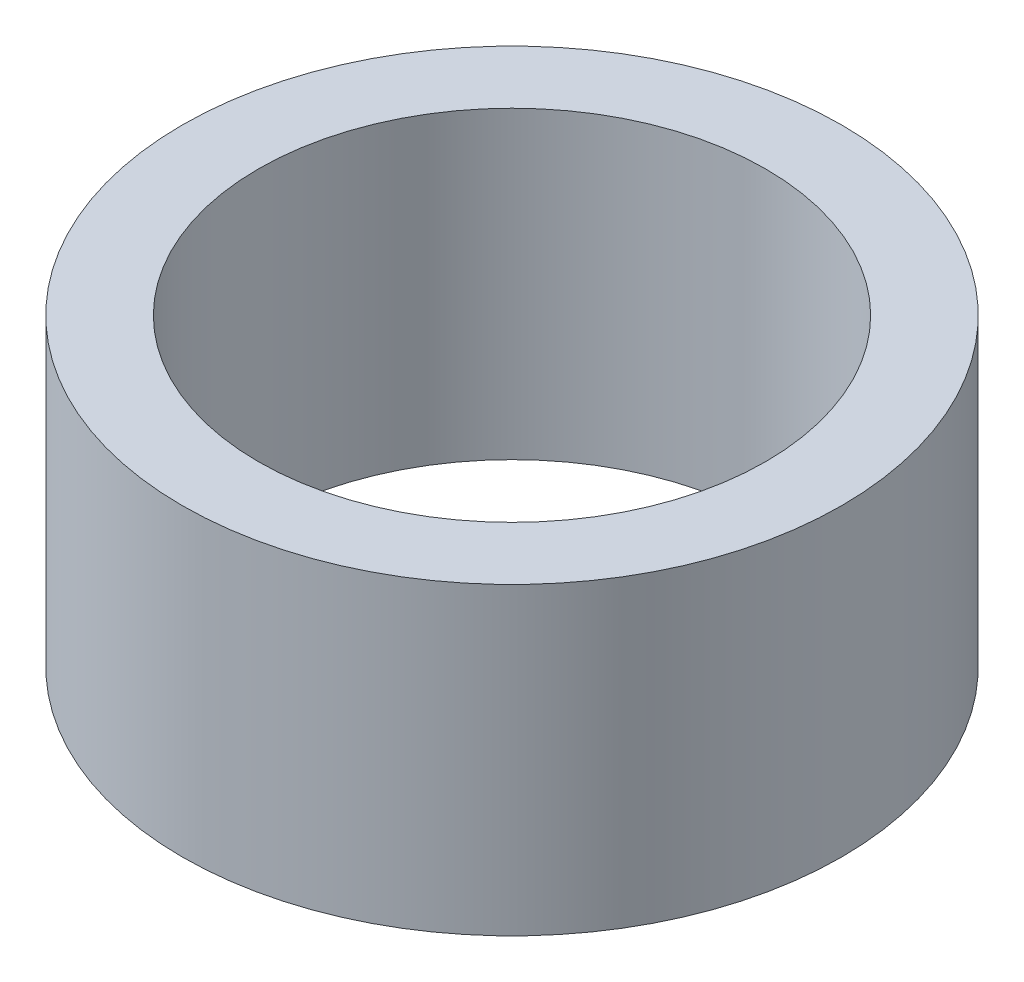
ISO-10303-21;
HEADER;
FILE_DESCRIPTION(('STEP AP214'),'2;1');
FILE_NAME('part.step','',(''),(''),'','','');
FILE_SCHEMA(('AUTOMOTIVE_DESIGN { 1 0 10303 214 1 1 1 1 }'));
ENDSEC;
DATA;
#1=APPLICATION_CONTEXT('core data for automotive mechanical design processes');
#2=APPLICATION_PROTOCOL_DEFINITION('international standard','automotive_design',2000,#1);
#3=PRODUCT_CONTEXT('',#1,'mechanical');
#4=PRODUCT('Part','Part','',(#3));
#5=PRODUCT_RELATED_PRODUCT_CATEGORY('part','',(#4));
#6=PRODUCT_DEFINITION_FORMATION('','',#4);
#7=PRODUCT_DEFINITION_CONTEXT('part definition',#1,'design');
#8=PRODUCT_DEFINITION('design','',#6,#7);
#9=PRODUCT_DEFINITION_SHAPE('','',#8);
#10=(LENGTH_UNIT() NAMED_UNIT(*) SI_UNIT(.MILLI.,.METRE.));
#11=(NAMED_UNIT(*) PLANE_ANGLE_UNIT() SI_UNIT($,.RADIAN.));
#12=(NAMED_UNIT(*) SI_UNIT($,.STERADIAN.) SOLID_ANGLE_UNIT());
#13=UNCERTAINTY_MEASURE_WITH_UNIT(LENGTH_MEASURE(1.E-05),#10,'distance_accuracy_value','');
#14=(GEOMETRIC_REPRESENTATION_CONTEXT(3) GLOBAL_UNCERTAINTY_ASSIGNED_CONTEXT((#13)) GLOBAL_UNIT_ASSIGNED_CONTEXT((#10,
#11,#12)) REPRESENTATION_CONTEXT('',''));
#15=CARTESIAN_POINT('',(0.,0.,0.));
#16=DIRECTION('',(0.,0.,1.));
#17=DIRECTION('',(1.,0.,0.));
#18=AXIS2_PLACEMENT_3D('',#15,#16,#17);
#19=CARTESIAN_POINT('',(0.,1.5,0.));
#20=DIRECTION('',(0.,1.,0.));
#21=DIRECTION('',(0.,0.,1.));
#22=AXIS2_PLACEMENT_3D('',#19,#20,#21);
#23=CYLINDRICAL_SURFACE('',#22,2.5);
#24=CARTESIAN_POINT('',(0.,0.,0.));
#25=DIRECTION('',(0.,1.,0.));
#26=DIRECTION('',(0.,0.,1.));
#27=AXIS2_PLACEMENT_3D('',#24,#25,#26);
#28=CIRCLE('',#27,2.5);
#29=CARTESIAN_POINT('',(0.,0.,2.5));
#30=VERTEX_POINT('',#29);
#31=EDGE_CURVE('E17',#30,#30,#28,.F.);
#32=ORIENTED_EDGE('',*,*,#31,.T.);
#33=EDGE_LOOP('',(#32));
#34=FACE_BOUND('',#33,.T.);
#35=CARTESIAN_POINT('',(0.,3.,0.));
#36=DIRECTION('',(0.,1.,0.));
#37=DIRECTION('',(0.,0.,1.));
#38=AXIS2_PLACEMENT_3D('',#35,#36,#37);
#39=CIRCLE('',#38,2.5);
#40=CARTESIAN_POINT('',(0.,3.,2.5));
#41=VERTEX_POINT('',#40);
#42=EDGE_CURVE('E26',#41,#41,#39,.F.);
#43=ORIENTED_EDGE('',*,*,#42,.F.);
#44=EDGE_LOOP('',(#43));
#45=FACE_BOUND('',#44,.T.);
#46=ADVANCED_FACE('F14',(#34,#45),#23,.F.);
#47=CARTESIAN_POINT('',(0.,0.,0.));
#48=DIRECTION('',(0.,1.,0.));
#49=DIRECTION('',(0.,0.,1.));
#50=AXIS2_PLACEMENT_3D('',#47,#48,#49);
#51=PLANE('',#50);
#52=ORIENTED_EDGE('',*,*,#31,.F.);
#53=EDGE_LOOP('',(#52));
#54=FACE_BOUND('',#53,.T.);
#55=CARTESIAN_POINT('',(0.,0.,0.));
#56=DIRECTION('',(0.,1.,0.));
#57=DIRECTION('',(0.,0.,1.));
#58=AXIS2_PLACEMENT_3D('',#55,#56,#57);
#59=CIRCLE('',#58,3.25);
#60=CARTESIAN_POINT('',(0.,0.,3.25));
#61=VERTEX_POINT('',#60);
#62=EDGE_CURVE('E21',#61,#61,#59,.T.);
#63=ORIENTED_EDGE('',*,*,#62,.F.);
#64=EDGE_LOOP('',(#63));
#65=FACE_BOUND('',#64,.T.);
#66=ADVANCED_FACE('F36',(#54,#65),#51,.F.);
#67=CARTESIAN_POINT('',(0.,3.,0.));
#68=DIRECTION('',(0.,1.,0.));
#69=DIRECTION('',(0.,0.,1.));
#70=AXIS2_PLACEMENT_3D('',#67,#68,#69);
#71=PLANE('',#70);
#72=ORIENTED_EDGE('',*,*,#42,.T.);
#73=EDGE_LOOP('',(#72));
#74=FACE_BOUND('',#73,.T.);
#75=CARTESIAN_POINT('',(0.,3.,0.));
#76=DIRECTION('',(0.,1.,0.));
#77=DIRECTION('',(0.,0.,1.));
#78=AXIS2_PLACEMENT_3D('',#75,#76,#77);
#79=CIRCLE('',#78,3.25);
#80=CARTESIAN_POINT('',(0.,3.,3.25));
#81=VERTEX_POINT('',#80);
#82=EDGE_CURVE('E10',#81,#81,#79,.F.);
#83=ORIENTED_EDGE('',*,*,#82,.F.);
#84=EDGE_LOOP('',(#83));
#85=FACE_BOUND('',#84,.T.);
#86=ADVANCED_FACE('F39',(#74,#85),#71,.T.);
#87=CARTESIAN_POINT('',(0.,1.5,0.));
#88=DIRECTION('',(0.,1.,0.));
#89=DIRECTION('',(0.,0.,1.));
#90=AXIS2_PLACEMENT_3D('',#87,#88,#89);
#91=CYLINDRICAL_SURFACE('',#90,3.25);
#92=ORIENTED_EDGE('',*,*,#62,.T.);
#93=EDGE_LOOP('',(#92));
#94=FACE_BOUND('',#93,.T.);
#95=ORIENTED_EDGE('',*,*,#82,.T.);
#96=EDGE_LOOP('',(#95));
#97=FACE_BOUND('',#96,.T.);
#98=ADVANCED_FACE('F42',(#94,#97),#91,.T.);
#99=CLOSED_SHELL('',(#46,#66,#86,#98));
#100=MANIFOLD_SOLID_BREP('B1',#99);
#101=ADVANCED_BREP_SHAPE_REPRESENTATION('',(#18,#100),#14);
#102=SHAPE_DEFINITION_REPRESENTATION(#9,#101);
ENDSEC;
END-ISO-10303-21;
